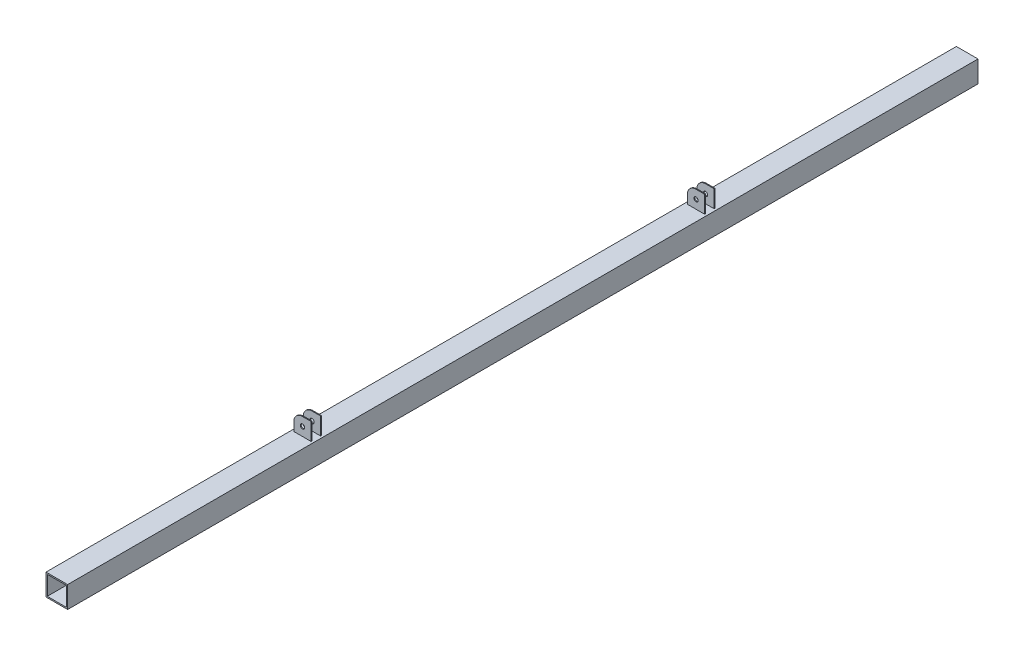
ISO-10303-21;
HEADER;
FILE_DESCRIPTION(('STEP AP214'),'2;1');
FILE_NAME('part.step','',(''),(''),'','','');
FILE_SCHEMA(('AUTOMOTIVE_DESIGN { 1 0 10303 214 1 1 1 1 }'));
ENDSEC;
DATA;
#1=APPLICATION_CONTEXT('core data for automotive mechanical design processes');
#2=APPLICATION_PROTOCOL_DEFINITION('international standard','automotive_design',2000,#1);
#3=PRODUCT_CONTEXT('',#1,'mechanical');
#4=PRODUCT('Part','Part','',(#3));
#5=PRODUCT_RELATED_PRODUCT_CATEGORY('part','',(#4));
#6=PRODUCT_DEFINITION_FORMATION('','',#4);
#7=PRODUCT_DEFINITION_CONTEXT('part definition',#1,'design');
#8=PRODUCT_DEFINITION('design','',#6,#7);
#9=PRODUCT_DEFINITION_SHAPE('','',#8);
#10=(LENGTH_UNIT() NAMED_UNIT(*) SI_UNIT(.MILLI.,.METRE.));
#11=(NAMED_UNIT(*) PLANE_ANGLE_UNIT() SI_UNIT($,.RADIAN.));
#12=(NAMED_UNIT(*) SI_UNIT($,.STERADIAN.) SOLID_ANGLE_UNIT());
#13=UNCERTAINTY_MEASURE_WITH_UNIT(LENGTH_MEASURE(1.E-05),#10,'distance_accuracy_value','');
#14=(GEOMETRIC_REPRESENTATION_CONTEXT(3) GLOBAL_UNCERTAINTY_ASSIGNED_CONTEXT((#13)) GLOBAL_UNIT_ASSIGNED_CONTEXT((#10,
#11,#12)) REPRESENTATION_CONTEXT('',''));
#15=CARTESIAN_POINT('',(0.,0.,0.));
#16=DIRECTION('',(0.,0.,1.));
#17=DIRECTION('',(1.,0.,0.));
#18=AXIS2_PLACEMENT_3D('',#15,#16,#17);
#19=CARTESIAN_POINT('',(-25.,25.,1052.5));
#20=DIRECTION('',(0.,-1.,0.));
#21=DIRECTION('',(0.,0.,-1.));
#22=AXIS2_PLACEMENT_3D('',#19,#20,#21);
#23=PLANE('',#22);
#24=DIRECTION('',(0.,0.,1.));
#25=VECTOR('',#24,1.);
#26=CARTESIAN_POINT('',(-20.,25.,460.5));
#27=LINE('',#26,#25);
#28=CARTESIAN_POINT('',(-20.,25.,460.5));
#29=VERTEX_POINT('',#28);
#30=CARTESIAN_POINT('',(-20.,25.,462.5));
#31=VERTEX_POINT('',#30);
#32=EDGE_CURVE('E264',#29,#31,#27,.T.);
#33=ORIENTED_EDGE('',*,*,#32,.F.);
#34=DIRECTION('',(-1.,0.,0.));
#35=VECTOR('',#34,1.);
#36=CARTESIAN_POINT('',(-20.,25.,460.5));
#37=LINE('',#36,#35);
#38=CARTESIAN_POINT('',(20.,25.,460.5));
#39=VERTEX_POINT('',#38);
#40=EDGE_CURVE('E268',#39,#29,#37,.T.);
#41=ORIENTED_EDGE('',*,*,#40,.F.);
#42=DIRECTION('',(0.,0.,-1.));
#43=VECTOR('',#42,1.);
#44=CARTESIAN_POINT('',(20.,25.,460.5));
#45=LINE('',#44,#43);
#46=CARTESIAN_POINT('',(20.,25.,462.5));
#47=VERTEX_POINT('',#46);
#48=EDGE_CURVE('E279',#47,#39,#45,.T.);
#49=ORIENTED_EDGE('',*,*,#48,.F.);
#50=DIRECTION('',(1.,0.,0.));
#51=VECTOR('',#50,1.);
#52=CARTESIAN_POINT('',(-20.,25.,462.5));
#53=LINE('',#52,#51);
#54=EDGE_CURVE('E276',#31,#47,#53,.T.);
#55=ORIENTED_EDGE('',*,*,#54,.F.);
#56=EDGE_LOOP('',(#33,#41,#49,#55));
#57=FACE_BOUND('',#56,.T.);
#58=DIRECTION('',(0.,0.,1.));
#59=VECTOR('',#58,1.);
#60=CARTESIAN_POINT('',(-20.0000000000001,25.,-449.5));
#61=LINE('',#60,#59);
#62=CARTESIAN_POINT('',(-20.0000000000001,25.,-449.5));
#63=VERTEX_POINT('',#62);
#64=CARTESIAN_POINT('',(-20.0000000000001,25.,-447.5));
#65=VERTEX_POINT('',#64);
#66=EDGE_CURVE('E322',#63,#65,#61,.T.);
#67=ORIENTED_EDGE('',*,*,#66,.F.);
#68=DIRECTION('',(-1.,0.,0.));
#69=VECTOR('',#68,1.);
#70=CARTESIAN_POINT('',(-20.0000000000001,25.,-449.5));
#71=LINE('',#70,#69);
#72=CARTESIAN_POINT('',(19.9999999999999,25.,-449.5));
#73=VERTEX_POINT('',#72);
#74=EDGE_CURVE('E326',#73,#63,#71,.T.);
#75=ORIENTED_EDGE('',*,*,#74,.F.);
#76=DIRECTION('',(0.,0.,-1.));
#77=VECTOR('',#76,1.);
#78=CARTESIAN_POINT('',(19.9999999999999,25.,-449.5));
#79=LINE('',#78,#77);
#80=CARTESIAN_POINT('',(19.9999999999999,25.,-447.5));
#81=VERTEX_POINT('',#80);
#82=EDGE_CURVE('E337',#81,#73,#79,.T.);
#83=ORIENTED_EDGE('',*,*,#82,.F.);
#84=DIRECTION('',(1.,0.,0.));
#85=VECTOR('',#84,1.);
#86=CARTESIAN_POINT('',(-20.0000000000001,25.,-447.5));
#87=LINE('',#86,#85);
#88=EDGE_CURVE('E334',#65,#81,#87,.T.);
#89=ORIENTED_EDGE('',*,*,#88,.F.);
#90=EDGE_LOOP('',(#67,#75,#83,#89));
#91=FACE_BOUND('',#90,.T.);
#92=DIRECTION('',(-1.,0.,0.));
#93=VECTOR('',#92,1.);
#94=CARTESIAN_POINT('',(-25.,25.,-1052.5));
#95=LINE('',#94,#93);
#96=CARTESIAN_POINT('',(25.,25.,-1052.5));
#97=VERTEX_POINT('',#96);
#98=CARTESIAN_POINT('',(-25.,25.,-1052.5));
#99=VERTEX_POINT('',#98);
#100=EDGE_CURVE('E396',#97,#99,#95,.T.);
#101=ORIENTED_EDGE('',*,*,#100,.T.);
#102=DIRECTION('',(0.,0.,-1.));
#103=VECTOR('',#102,1.);
#104=CARTESIAN_POINT('',(-25.,25.,1052.5));
#105=LINE('',#104,#103);
#106=CARTESIAN_POINT('',(-25.,25.,1052.5));
#107=VERTEX_POINT('',#106);
#108=EDGE_CURVE('E406',#107,#99,#105,.T.);
#109=ORIENTED_EDGE('',*,*,#108,.F.);
#110=DIRECTION('',(-1.,0.,0.));
#111=VECTOR('',#110,1.);
#112=CARTESIAN_POINT('',(-25.,25.,1052.5));
#113=LINE('',#112,#111);
#114=CARTESIAN_POINT('',(25.,25.,1052.5));
#115=VERTEX_POINT('',#114);
#116=EDGE_CURVE('E386',#115,#107,#113,.T.);
#117=ORIENTED_EDGE('',*,*,#116,.F.);
#118=DIRECTION('',(0.,0.,-1.));
#119=VECTOR('',#118,1.);
#120=CARTESIAN_POINT('',(25.,25.,1052.5));
#121=LINE('',#120,#119);
#122=EDGE_CURVE('E409',#115,#97,#121,.T.);
#123=ORIENTED_EDGE('',*,*,#122,.T.);
#124=EDGE_LOOP('',(#101,#109,#117,#123));
#125=FACE_BOUND('',#124,.T.);
#126=DIRECTION('',(0.,0.,1.));
#127=VECTOR('',#126,1.);
#128=CARTESIAN_POINT('',(-20.0000000000001,25.,-427.5));
#129=LINE('',#128,#127);
#130=CARTESIAN_POINT('',(-20.0000000000001,25.,-427.5));
#131=VERTEX_POINT('',#130);
#132=CARTESIAN_POINT('',(-20.0000000000001,25.,-425.5));
#133=VERTEX_POINT('',#132);
#134=EDGE_CURVE('E293',#131,#133,#129,.T.);
#135=ORIENTED_EDGE('',*,*,#134,.F.);
#136=DIRECTION('',(-1.,0.,0.));
#137=VECTOR('',#136,1.);
#138=CARTESIAN_POINT('',(-20.0000000000001,25.,-427.5));
#139=LINE('',#138,#137);
#140=CARTESIAN_POINT('',(19.9999999999999,25.,-427.5));
#141=VERTEX_POINT('',#140);
#142=EDGE_CURVE('E297',#141,#131,#139,.T.);
#143=ORIENTED_EDGE('',*,*,#142,.F.);
#144=DIRECTION('',(0.,0.,-1.));
#145=VECTOR('',#144,1.);
#146=CARTESIAN_POINT('',(19.9999999999999,25.,-427.5));
#147=LINE('',#146,#145);
#148=CARTESIAN_POINT('',(19.9999999999999,25.,-425.5));
#149=VERTEX_POINT('',#148);
#150=EDGE_CURVE('E308',#149,#141,#147,.T.);
#151=ORIENTED_EDGE('',*,*,#150,.F.);
#152=DIRECTION('',(1.,0.,0.));
#153=VECTOR('',#152,1.);
#154=CARTESIAN_POINT('',(-20.0000000000001,25.,-425.5));
#155=LINE('',#154,#153);
#156=EDGE_CURVE('E305',#133,#149,#155,.T.);
#157=ORIENTED_EDGE('',*,*,#156,.F.);
#158=EDGE_LOOP('',(#135,#143,#151,#157));
#159=FACE_BOUND('',#158,.T.);
#160=DIRECTION('',(0.,0.,1.));
#161=VECTOR('',#160,1.);
#162=CARTESIAN_POINT('',(-20.,25.,482.5));
#163=LINE('',#162,#161);
#164=CARTESIAN_POINT('',(-20.,25.,482.5));
#165=VERTEX_POINT('',#164);
#166=CARTESIAN_POINT('',(-20.,25.,484.5));
#167=VERTEX_POINT('',#166);
#168=EDGE_CURVE('E252',#165,#167,#163,.T.);
#169=ORIENTED_EDGE('',*,*,#168,.F.);
#170=DIRECTION('',(-1.,0.,0.));
#171=VECTOR('',#170,1.);
#172=CARTESIAN_POINT('',(-20.,25.,482.5));
#173=LINE('',#172,#171);
#174=CARTESIAN_POINT('',(20.,25.,482.5));
#175=VERTEX_POINT('',#174);
#176=EDGE_CURVE('E230',#175,#165,#173,.T.);
#177=ORIENTED_EDGE('',*,*,#176,.F.);
#178=DIRECTION('',(0.,0.,-1.));
#179=VECTOR('',#178,1.);
#180=CARTESIAN_POINT('',(20.,25.,482.5));
#181=LINE('',#180,#179);
#182=CARTESIAN_POINT('',(20.,25.,484.5));
#183=VERTEX_POINT('',#182);
#184=EDGE_CURVE('E257',#183,#175,#181,.T.);
#185=ORIENTED_EDGE('',*,*,#184,.F.);
#186=DIRECTION('',(1.,0.,0.));
#187=VECTOR('',#186,1.);
#188=CARTESIAN_POINT('',(-20.,25.,484.5));
#189=LINE('',#188,#187);
#190=EDGE_CURVE('E237',#167,#183,#189,.T.);
#191=ORIENTED_EDGE('',*,*,#190,.F.);
#192=EDGE_LOOP('',(#169,#177,#185,#191));
#193=FACE_BOUND('',#192,.T.);
#194=ADVANCED_FACE('F37',(#57,#91,#125,#159,#193),#23,.F.);
#195=CARTESIAN_POINT('',(0.,0.,1052.5));
#196=DIRECTION('',(0.,0.,-1.));
#197=DIRECTION('',(-1.,0.,0.));
#198=AXIS2_PLACEMENT_3D('',#195,#196,#197);
#199=PLANE('',#198);
#200=DIRECTION('',(0.,1.,0.));
#201=VECTOR('',#200,1.);
#202=CARTESIAN_POINT('',(25.,-25.,1052.5));
#203=LINE('',#202,#201);
#204=CARTESIAN_POINT('',(25.,-25.,1052.5));
#205=VERTEX_POINT('',#204);
#206=EDGE_CURVE('E383',#205,#115,#203,.T.);
#207=ORIENTED_EDGE('',*,*,#206,.T.);
#208=ORIENTED_EDGE('',*,*,#116,.T.);
#209=DIRECTION('',(0.,-1.,0.));
#210=VECTOR('',#209,1.);
#211=CARTESIAN_POINT('',(-25.,-25.,1052.5));
#212=LINE('',#211,#210);
#213=CARTESIAN_POINT('',(-25.,-25.,1052.5));
#214=VERTEX_POINT('',#213);
#215=EDGE_CURVE('E389',#107,#214,#212,.T.);
#216=ORIENTED_EDGE('',*,*,#215,.T.);
#217=DIRECTION('',(1.,0.,0.));
#218=VECTOR('',#217,1.);
#219=CARTESIAN_POINT('',(-25.,-25.,1052.5));
#220=LINE('',#219,#218);
#221=EDGE_CURVE('E391',#214,#205,#220,.T.);
#222=ORIENTED_EDGE('',*,*,#221,.T.);
#223=EDGE_LOOP('',(#207,#208,#216,#222));
#224=FACE_BOUND('',#223,.T.);
#225=DIRECTION('',(0.,1.,0.));
#226=VECTOR('',#225,1.);
#227=CARTESIAN_POINT('',(22.,-22.,1052.5));
#228=LINE('',#227,#226);
#229=CARTESIAN_POINT('',(22.,-22.,1052.5));
#230=VERTEX_POINT('',#229);
#231=CARTESIAN_POINT('',(22.,22.,1052.5));
#232=VERTEX_POINT('',#231);
#233=EDGE_CURVE('E352',#230,#232,#228,.T.);
#234=ORIENTED_EDGE('',*,*,#233,.F.);
#235=DIRECTION('',(1.,0.,0.));
#236=VECTOR('',#235,1.);
#237=CARTESIAN_POINT('',(-22.,-22.,1052.5));
#238=LINE('',#237,#236);
#239=CARTESIAN_POINT('',(-22.,-22.,1052.5));
#240=VERTEX_POINT('',#239);
#241=EDGE_CURVE('E360',#240,#230,#238,.T.);
#242=ORIENTED_EDGE('',*,*,#241,.F.);
#243=DIRECTION('',(0.,-1.,0.));
#244=VECTOR('',#243,1.);
#245=CARTESIAN_POINT('',(-22.,-22.,1052.5));
#246=LINE('',#245,#244);
#247=CARTESIAN_POINT('',(-22.,22.,1052.5));
#248=VERTEX_POINT('',#247);
#249=EDGE_CURVE('E357',#248,#240,#246,.T.);
#250=ORIENTED_EDGE('',*,*,#249,.F.);
#251=DIRECTION('',(-1.,0.,0.));
#252=VECTOR('',#251,1.);
#253=CARTESIAN_POINT('',(-22.,22.,1052.5));
#254=LINE('',#253,#252);
#255=EDGE_CURVE('E354',#232,#248,#254,.T.);
#256=ORIENTED_EDGE('',*,*,#255,.F.);
#257=EDGE_LOOP('',(#234,#242,#250,#256));
#258=FACE_BOUND('',#257,.T.);
#259=ADVANCED_FACE('F468',(#224,#258),#199,.F.);
#260=CARTESIAN_POINT('',(0.,0.,-1052.5));
#261=DIRECTION('',(0.,0.,-1.));
#262=DIRECTION('',(-1.,0.,0.));
#263=AXIS2_PLACEMENT_3D('',#260,#261,#262);
#264=PLANE('',#263);
#265=DIRECTION('',(0.,1.,0.));
#266=VECTOR('',#265,1.);
#267=CARTESIAN_POINT('',(25.,-25.,-1052.5));
#268=LINE('',#267,#266);
#269=CARTESIAN_POINT('',(25.,-25.,-1052.5));
#270=VERTEX_POINT('',#269);
#271=EDGE_CURVE('E382',#270,#97,#268,.T.);
#272=ORIENTED_EDGE('',*,*,#271,.F.);
#273=DIRECTION('',(1.,0.,0.));
#274=VECTOR('',#273,1.);
#275=CARTESIAN_POINT('',(-25.,-25.,-1052.5));
#276=LINE('',#275,#274);
#277=CARTESIAN_POINT('',(-25.,-25.,-1052.5));
#278=VERTEX_POINT('',#277);
#279=EDGE_CURVE('E387',#278,#270,#276,.T.);
#280=ORIENTED_EDGE('',*,*,#279,.F.);
#281=DIRECTION('',(0.,-1.,0.));
#282=VECTOR('',#281,1.);
#283=CARTESIAN_POINT('',(-25.,-25.,-1052.5));
#284=LINE('',#283,#282);
#285=EDGE_CURVE('E398',#99,#278,#284,.T.);
#286=ORIENTED_EDGE('',*,*,#285,.F.);
#287=ORIENTED_EDGE('',*,*,#100,.F.);
#288=EDGE_LOOP('',(#272,#280,#286,#287));
#289=FACE_BOUND('',#288,.T.);
#290=DIRECTION('',(1.,0.,0.));
#291=VECTOR('',#290,1.);
#292=CARTESIAN_POINT('',(-22.,-22.,-1052.5));
#293=LINE('',#292,#291);
#294=CARTESIAN_POINT('',(-22.,-22.,-1052.5));
#295=VERTEX_POINT('',#294);
#296=CARTESIAN_POINT('',(22.,-22.,-1052.5));
#297=VERTEX_POINT('',#296);
#298=EDGE_CURVE('E355',#295,#297,#293,.T.);
#299=ORIENTED_EDGE('',*,*,#298,.T.);
#300=DIRECTION('',(0.,1.,0.));
#301=VECTOR('',#300,1.);
#302=CARTESIAN_POINT('',(22.,-22.,-1052.5));
#303=LINE('',#302,#301);
#304=CARTESIAN_POINT('',(22.,22.,-1052.5));
#305=VERTEX_POINT('',#304);
#306=EDGE_CURVE('E351',#297,#305,#303,.T.);
#307=ORIENTED_EDGE('',*,*,#306,.T.);
#308=DIRECTION('',(-1.,0.,0.));
#309=VECTOR('',#308,1.);
#310=CARTESIAN_POINT('',(-22.,22.,-1052.5));
#311=LINE('',#310,#309);
#312=CARTESIAN_POINT('',(-22.,22.,-1052.5));
#313=VERTEX_POINT('',#312);
#314=EDGE_CURVE('E365',#305,#313,#311,.T.);
#315=ORIENTED_EDGE('',*,*,#314,.T.);
#316=DIRECTION('',(0.,-1.,0.));
#317=VECTOR('',#316,1.);
#318=CARTESIAN_POINT('',(-22.,-22.,-1052.5));
#319=LINE('',#318,#317);
#320=EDGE_CURVE('E368',#313,#295,#319,.T.);
#321=ORIENTED_EDGE('',*,*,#320,.T.);
#322=EDGE_LOOP('',(#299,#307,#315,#321));
#323=FACE_BOUND('',#322,.T.);
#324=ADVANCED_FACE('F474',(#289,#323),#264,.T.);
#325=CARTESIAN_POINT('',(25.,-25.,1052.5));
#326=DIRECTION('',(-1.,0.,0.));
#327=DIRECTION('',(0.,0.,1.));
#328=AXIS2_PLACEMENT_3D('',#325,#326,#327);
#329=PLANE('',#328);
#330=ORIENTED_EDGE('',*,*,#271,.T.);
#331=ORIENTED_EDGE('',*,*,#122,.F.);
#332=ORIENTED_EDGE('',*,*,#206,.F.);
#333=DIRECTION('',(0.,0.,-1.));
#334=VECTOR('',#333,1.);
#335=CARTESIAN_POINT('',(25.,-25.,1052.5));
#336=LINE('',#335,#334);
#337=EDGE_CURVE('E393',#205,#270,#336,.T.);
#338=ORIENTED_EDGE('',*,*,#337,.T.);
#339=EDGE_LOOP('',(#330,#331,#332,#338));
#340=FACE_BOUND('',#339,.T.);
#341=ADVANCED_FACE('F483',(#340),#329,.F.);
#342=CARTESIAN_POINT('',(-25.,-25.,1052.5));
#343=DIRECTION('',(1.,0.,0.));
#344=DIRECTION('',(0.,0.,-1.));
#345=AXIS2_PLACEMENT_3D('',#342,#343,#344);
#346=PLANE('',#345);
#347=ORIENTED_EDGE('',*,*,#285,.T.);
#348=DIRECTION('',(0.,0.,-1.));
#349=VECTOR('',#348,1.);
#350=CARTESIAN_POINT('',(-25.,-25.,1052.5));
#351=LINE('',#350,#349);
#352=EDGE_CURVE('E403',#214,#278,#351,.T.);
#353=ORIENTED_EDGE('',*,*,#352,.F.);
#354=ORIENTED_EDGE('',*,*,#215,.F.);
#355=ORIENTED_EDGE('',*,*,#108,.T.);
#356=EDGE_LOOP('',(#347,#353,#354,#355));
#357=FACE_BOUND('',#356,.T.);
#358=ADVANCED_FACE('F481',(#357),#346,.F.);
#359=CARTESIAN_POINT('',(-25.,-25.,1052.5));
#360=DIRECTION('',(0.,1.,0.));
#361=DIRECTION('',(0.,0.,1.));
#362=AXIS2_PLACEMENT_3D('',#359,#360,#361);
#363=PLANE('',#362);
#364=ORIENTED_EDGE('',*,*,#279,.T.);
#365=ORIENTED_EDGE('',*,*,#337,.F.);
#366=ORIENTED_EDGE('',*,*,#221,.F.);
#367=ORIENTED_EDGE('',*,*,#352,.T.);
#368=EDGE_LOOP('',(#364,#365,#366,#367));
#369=FACE_BOUND('',#368,.T.);
#370=ADVANCED_FACE('F576',(#369),#363,.F.);
#371=CARTESIAN_POINT('',(22.,-22.,1052.5));
#372=DIRECTION('',(-1.,0.,0.));
#373=DIRECTION('',(0.,0.,1.));
#374=AXIS2_PLACEMENT_3D('',#371,#372,#373);
#375=PLANE('',#374);
#376=ORIENTED_EDGE('',*,*,#306,.F.);
#377=DIRECTION('',(0.,0.,-1.));
#378=VECTOR('',#377,1.);
#379=CARTESIAN_POINT('',(22.,-22.,1052.5));
#380=LINE('',#379,#378);
#381=EDGE_CURVE('E362',#230,#297,#380,.T.);
#382=ORIENTED_EDGE('',*,*,#381,.F.);
#383=ORIENTED_EDGE('',*,*,#233,.T.);
#384=DIRECTION('',(0.,0.,-1.));
#385=VECTOR('',#384,1.);
#386=CARTESIAN_POINT('',(22.,22.,1052.5));
#387=LINE('',#386,#385);
#388=EDGE_CURVE('E379',#232,#305,#387,.T.);
#389=ORIENTED_EDGE('',*,*,#388,.T.);
#390=EDGE_LOOP('',(#376,#382,#383,#389));
#391=FACE_BOUND('',#390,.T.);
#392=ADVANCED_FACE('F573',(#391),#375,.T.);
#393=CARTESIAN_POINT('',(-22.,22.,1052.5));
#394=DIRECTION('',(0.,-1.,0.));
#395=DIRECTION('',(0.,0.,-1.));
#396=AXIS2_PLACEMENT_3D('',#393,#394,#395);
#397=PLANE('',#396);
#398=ORIENTED_EDGE('',*,*,#314,.F.);
#399=ORIENTED_EDGE('',*,*,#388,.F.);
#400=ORIENTED_EDGE('',*,*,#255,.T.);
#401=DIRECTION('',(0.,0.,-1.));
#402=VECTOR('',#401,1.);
#403=CARTESIAN_POINT('',(-22.,22.,1052.5));
#404=LINE('',#403,#402);
#405=EDGE_CURVE('E377',#248,#313,#404,.T.);
#406=ORIENTED_EDGE('',*,*,#405,.T.);
#407=EDGE_LOOP('',(#398,#399,#400,#406));
#408=FACE_BOUND('',#407,.T.);
#409=ADVANCED_FACE('F569',(#408),#397,.T.);
#410=CARTESIAN_POINT('',(-22.,-22.,1052.5));
#411=DIRECTION('',(1.,0.,0.));
#412=DIRECTION('',(0.,0.,-1.));
#413=AXIS2_PLACEMENT_3D('',#410,#411,#412);
#414=PLANE('',#413);
#415=ORIENTED_EDGE('',*,*,#320,.F.);
#416=ORIENTED_EDGE('',*,*,#405,.F.);
#417=ORIENTED_EDGE('',*,*,#249,.T.);
#418=DIRECTION('',(0.,0.,-1.));
#419=VECTOR('',#418,1.);
#420=CARTESIAN_POINT('',(-22.,-22.,1052.5));
#421=LINE('',#420,#419);
#422=EDGE_CURVE('E375',#240,#295,#421,.T.);
#423=ORIENTED_EDGE('',*,*,#422,.T.);
#424=EDGE_LOOP('',(#415,#416,#417,#423));
#425=FACE_BOUND('',#424,.T.);
#426=ADVANCED_FACE('F565',(#425),#414,.T.);
#427=CARTESIAN_POINT('',(-22.,-22.,1052.5));
#428=DIRECTION('',(0.,1.,0.));
#429=DIRECTION('',(0.,0.,1.));
#430=AXIS2_PLACEMENT_3D('',#427,#428,#429);
#431=PLANE('',#430);
#432=ORIENTED_EDGE('',*,*,#298,.F.);
#433=ORIENTED_EDGE('',*,*,#422,.F.);
#434=ORIENTED_EDGE('',*,*,#241,.T.);
#435=ORIENTED_EDGE('',*,*,#381,.T.);
#436=EDGE_LOOP('',(#432,#433,#434,#435));
#437=FACE_BOUND('',#436,.T.);
#438=ADVANCED_FACE('F562',(#437),#431,.T.);
#439=CARTESIAN_POINT('',(-20.0000000000001,65.,-449.5));
#440=DIRECTION('',(1.,0.,0.));
#441=DIRECTION('',(0.,0.,-1.));
#442=AXIS2_PLACEMENT_3D('',#439,#440,#441);
#443=PLANE('',#442);
#444=DIRECTION('',(0.,-1.,0.));
#445=VECTOR('',#444,1.);
#446=CARTESIAN_POINT('',(-20.0000000000001,65.,-447.5));
#447=LINE('',#446,#445);
#448=CARTESIAN_POINT('',(-20.0000000000001,45.,-447.5));
#449=VERTEX_POINT('',#448);
#450=EDGE_CURVE('E349',#449,#65,#447,.T.);
#451=ORIENTED_EDGE('',*,*,#450,.F.);
#452=DIRECTION('',(0.,0.,1.));
#453=VECTOR('',#452,1.);
#454=CARTESIAN_POINT('',(-20.0000000000001,45.,-449.5));
#455=LINE('',#454,#453);
#456=CARTESIAN_POINT('',(-20.0000000000001,45.,-449.5));
#457=VERTEX_POINT('',#456);
#458=EDGE_CURVE('E45',#449,#457,#455,.F.);
#459=ORIENTED_EDGE('',*,*,#458,.T.);
#460=DIRECTION('',(0.,-1.,0.));
#461=VECTOR('',#460,1.);
#462=CARTESIAN_POINT('',(-20.0000000000001,65.,-449.5));
#463=LINE('',#462,#461);
#464=EDGE_CURVE('E331',#457,#63,#463,.T.);
#465=ORIENTED_EDGE('',*,*,#464,.T.);
#466=ORIENTED_EDGE('',*,*,#66,.T.);
#467=EDGE_LOOP('',(#451,#459,#465,#466));
#468=FACE_BOUND('',#467,.T.);
#469=ADVANCED_FACE('F558',(#468),#443,.F.);
#470=CARTESIAN_POINT('',(-20.0000000000001,65.,-447.5));
#471=DIRECTION('',(0.,0.,-1.));
#472=DIRECTION('',(-1.,0.,0.));
#473=AXIS2_PLACEMENT_3D('',#470,#471,#472);
#474=PLANE('',#473);
#475=CARTESIAN_POINT('',(0.,45.,-447.5));
#476=DIRECTION('',(0.,0.,-1.));
#477=DIRECTION('',(-1.,0.,0.));
#478=AXIS2_PLACEMENT_3D('',#475,#476,#477);
#479=CIRCLE('',#478,5.);
#480=CARTESIAN_POINT('',(-5.00000000000001,45.,-447.5));
#481=VERTEX_POINT('',#480);
#482=EDGE_CURVE('E255',#481,#481,#479,.T.);
#483=ORIENTED_EDGE('',*,*,#482,.T.);
#484=EDGE_LOOP('',(#483));
#485=FACE_BOUND('',#484,.T.);
#486=DIRECTION('',(1.,0.,0.));
#487=VECTOR('',#486,1.);
#488=CARTESIAN_POINT('',(-20.0000000000001,65.,-447.5));
#489=LINE('',#488,#487);
#490=CARTESIAN_POINT('',(-1.17961196366423E-13,65.,-447.5));
#491=VERTEX_POINT('',#490);
#492=CARTESIAN_POINT('',(19.9999999999999,65.,-447.5));
#493=VERTEX_POINT('',#492);
#494=EDGE_CURVE('E323',#491,#493,#489,.T.);
#495=ORIENTED_EDGE('',*,*,#494,.F.);
#496=CARTESIAN_POINT('',(-1.17961196366423E-13,45.,-447.5));
#497=DIRECTION('',(0.,0.,-1.));
#498=DIRECTION('',(-1.,0.,0.));
#499=AXIS2_PLACEMENT_3D('',#496,#497,#498);
#500=CIRCLE('',#499,20.);
#501=EDGE_CURVE('E59',#491,#449,#500,.F.);
#502=ORIENTED_EDGE('',*,*,#501,.T.);
#503=ORIENTED_EDGE('',*,*,#450,.T.);
#504=ORIENTED_EDGE('',*,*,#88,.T.);
#505=DIRECTION('',(0.,-1.,0.));
#506=VECTOR('',#505,1.);
#507=CARTESIAN_POINT('',(19.9999999999999,65.,-447.5));
#508=LINE('',#507,#506);
#509=EDGE_CURVE('E346',#493,#81,#508,.T.);
#510=ORIENTED_EDGE('',*,*,#509,.F.);
#511=EDGE_LOOP('',(#495,#502,#503,#504,#510));
#512=FACE_BOUND('',#511,.T.);
#513=ADVANCED_FACE('F452',(#485,#512),#474,.F.);
#514=CARTESIAN_POINT('',(19.9999999999999,65.,-449.5));
#515=DIRECTION('',(-1.,0.,0.));
#516=DIRECTION('',(0.,0.,1.));
#517=AXIS2_PLACEMENT_3D('',#514,#515,#516);
#518=PLANE('',#517);
#519=ORIENTED_EDGE('',*,*,#82,.T.);
#520=DIRECTION('',(0.,-1.,0.));
#521=VECTOR('',#520,1.);
#522=CARTESIAN_POINT('',(19.9999999999999,65.,-449.5));
#523=LINE('',#522,#521);
#524=CARTESIAN_POINT('',(19.9999999999999,65.,-449.5));
#525=VERTEX_POINT('',#524);
#526=EDGE_CURVE('E343',#525,#73,#523,.T.);
#527=ORIENTED_EDGE('',*,*,#526,.F.);
#528=DIRECTION('',(0.,0.,-1.));
#529=VECTOR('',#528,1.);
#530=CARTESIAN_POINT('',(19.9999999999999,65.,-449.5));
#531=LINE('',#530,#529);
#532=EDGE_CURVE('E325',#493,#525,#531,.T.);
#533=ORIENTED_EDGE('',*,*,#532,.F.);
#534=ORIENTED_EDGE('',*,*,#509,.T.);
#535=EDGE_LOOP('',(#519,#527,#533,#534));
#536=FACE_BOUND('',#535,.T.);
#537=ADVANCED_FACE('F457',(#536),#518,.F.);
#538=CARTESIAN_POINT('',(-20.0000000000001,65.,-449.5));
#539=DIRECTION('',(0.,0.,1.));
#540=DIRECTION('',(1.,0.,0.));
#541=AXIS2_PLACEMENT_3D('',#538,#539,#540);
#542=PLANE('',#541);
#543=CARTESIAN_POINT('',(0.,45.,-449.5));
#544=DIRECTION('',(0.,0.,1.));
#545=DIRECTION('',(1.,0.,0.));
#546=AXIS2_PLACEMENT_3D('',#543,#544,#545);
#547=CIRCLE('',#546,5.);
#548=CARTESIAN_POINT('',(4.99999999999999,45.,-449.5));
#549=VERTEX_POINT('',#548);
#550=EDGE_CURVE('E650',#549,#549,#547,.T.);
#551=ORIENTED_EDGE('',*,*,#550,.T.);
#552=EDGE_LOOP('',(#551));
#553=FACE_BOUND('',#552,.T.);
#554=ORIENTED_EDGE('',*,*,#464,.F.);
#555=CARTESIAN_POINT('',(-1.17961196366423E-13,45.,-449.5));
#556=DIRECTION('',(0.,0.,1.));
#557=DIRECTION('',(1.,0.,0.));
#558=AXIS2_PLACEMENT_3D('',#555,#556,#557);
#559=CIRCLE('',#558,20.);
#560=CARTESIAN_POINT('',(-1.17961196366423E-13,65.,-449.5));
#561=VERTEX_POINT('',#560);
#562=EDGE_CURVE('E11',#457,#561,#559,.F.);
#563=ORIENTED_EDGE('',*,*,#562,.T.);
#564=DIRECTION('',(-1.,0.,0.));
#565=VECTOR('',#564,1.);
#566=CARTESIAN_POINT('',(-20.0000000000001,65.,-449.5));
#567=LINE('',#566,#565);
#568=EDGE_CURVE('E328',#525,#561,#567,.T.);
#569=ORIENTED_EDGE('',*,*,#568,.F.);
#570=ORIENTED_EDGE('',*,*,#526,.T.);
#571=ORIENTED_EDGE('',*,*,#74,.T.);
#572=EDGE_LOOP('',(#554,#563,#569,#570,#571));
#573=FACE_BOUND('',#572,.T.);
#574=ADVANCED_FACE('F459',(#553,#573),#542,.F.);
#575=CARTESIAN_POINT('',(0.,65.,0.));
#576=DIRECTION('',(0.,1.,0.));
#577=DIRECTION('',(0.,0.,1.));
#578=AXIS2_PLACEMENT_3D('',#575,#576,#577);
#579=PLANE('',#578);
#580=ORIENTED_EDGE('',*,*,#568,.T.);
#581=DIRECTION('',(0.,0.,1.));
#582=VECTOR('',#581,1.);
#583=CARTESIAN_POINT('',(-1.17961196366423E-13,65.,-447.5));
#584=LINE('',#583,#582);
#585=EDGE_CURVE('E442',#561,#491,#584,.T.);
#586=ORIENTED_EDGE('',*,*,#585,.T.);
#587=ORIENTED_EDGE('',*,*,#494,.T.);
#588=ORIENTED_EDGE('',*,*,#532,.T.);
#589=EDGE_LOOP('',(#580,#586,#587,#588));
#590=FACE_BOUND('',#589,.T.);
#591=ADVANCED_FACE('F447',(#590),#579,.T.);
#592=CARTESIAN_POINT('',(-20.0000000000001,65.,-427.5));
#593=DIRECTION('',(1.,0.,0.));
#594=DIRECTION('',(0.,0.,-1.));
#595=AXIS2_PLACEMENT_3D('',#592,#593,#594);
#596=PLANE('',#595);
#597=DIRECTION('',(0.,-1.,0.));
#598=VECTOR('',#597,1.);
#599=CARTESIAN_POINT('',(-20.0000000000001,65.,-425.5));
#600=LINE('',#599,#598);
#601=CARTESIAN_POINT('',(-20.0000000000001,45.,-425.5));
#602=VERTEX_POINT('',#601);
#603=EDGE_CURVE('E320',#602,#133,#600,.T.);
#604=ORIENTED_EDGE('',*,*,#603,.F.);
#605=DIRECTION('',(0.,0.,1.));
#606=VECTOR('',#605,1.);
#607=CARTESIAN_POINT('',(-20.0000000000001,45.,-427.5));
#608=LINE('',#607,#606);
#609=CARTESIAN_POINT('',(-20.0000000000001,45.,-427.5));
#610=VERTEX_POINT('',#609);
#611=EDGE_CURVE('E438',#602,#610,#608,.F.);
#612=ORIENTED_EDGE('',*,*,#611,.T.);
#613=DIRECTION('',(0.,-1.,0.));
#614=VECTOR('',#613,1.);
#615=CARTESIAN_POINT('',(-20.0000000000001,65.,-427.5));
#616=LINE('',#615,#614);
#617=EDGE_CURVE('E302',#610,#131,#616,.T.);
#618=ORIENTED_EDGE('',*,*,#617,.T.);
#619=ORIENTED_EDGE('',*,*,#134,.T.);
#620=EDGE_LOOP('',(#604,#612,#618,#619));
#621=FACE_BOUND('',#620,.T.);
#622=ADVANCED_FACE('F544',(#621),#596,.F.);
#623=CARTESIAN_POINT('',(-20.0000000000001,65.,-425.5));
#624=DIRECTION('',(0.,0.,-1.));
#625=DIRECTION('',(-1.,0.,0.));
#626=AXIS2_PLACEMENT_3D('',#623,#624,#625);
#627=PLANE('',#626);
#628=CARTESIAN_POINT('',(0.,45.,-425.5));
#629=DIRECTION('',(0.,0.,-1.));
#630=DIRECTION('',(-1.,0.,0.));
#631=AXIS2_PLACEMENT_3D('',#628,#629,#630);
#632=CIRCLE('',#631,5.);
#633=CARTESIAN_POINT('',(-5.00000000000001,45.,-425.5));
#634=VERTEX_POINT('',#633);
#635=EDGE_CURVE('E647',#634,#634,#632,.T.);
#636=ORIENTED_EDGE('',*,*,#635,.T.);
#637=EDGE_LOOP('',(#636));
#638=FACE_BOUND('',#637,.T.);
#639=DIRECTION('',(1.,0.,0.));
#640=VECTOR('',#639,1.);
#641=CARTESIAN_POINT('',(-20.0000000000001,65.,-425.5));
#642=LINE('',#641,#640);
#643=CARTESIAN_POINT('',(-1.14491749414469E-13,65.,-425.5));
#644=VERTEX_POINT('',#643);
#645=CARTESIAN_POINT('',(19.9999999999999,65.,-425.5));
#646=VERTEX_POINT('',#645);
#647=EDGE_CURVE('E294',#644,#646,#642,.T.);
#648=ORIENTED_EDGE('',*,*,#647,.F.);
#649=CARTESIAN_POINT('',(-1.14491749414469E-13,45.,-425.5));
#650=DIRECTION('',(0.,0.,-1.));
#651=DIRECTION('',(-1.,0.,0.));
#652=AXIS2_PLACEMENT_3D('',#649,#650,#651);
#653=CIRCLE('',#652,20.);
#654=EDGE_CURVE('E436',#644,#602,#653,.F.);
#655=ORIENTED_EDGE('',*,*,#654,.T.);
#656=ORIENTED_EDGE('',*,*,#603,.T.);
#657=ORIENTED_EDGE('',*,*,#156,.T.);
#658=DIRECTION('',(0.,-1.,0.));
#659=VECTOR('',#658,1.);
#660=CARTESIAN_POINT('',(19.9999999999999,65.,-425.5));
#661=LINE('',#660,#659);
#662=EDGE_CURVE('E317',#646,#149,#661,.T.);
#663=ORIENTED_EDGE('',*,*,#662,.F.);
#664=EDGE_LOOP('',(#648,#655,#656,#657,#663));
#665=FACE_BOUND('',#664,.T.);
#666=ADVANCED_FACE('F540',(#638,#665),#627,.F.);
#667=CARTESIAN_POINT('',(19.9999999999999,65.,-427.5));
#668=DIRECTION('',(-1.,0.,0.));
#669=DIRECTION('',(0.,0.,1.));
#670=AXIS2_PLACEMENT_3D('',#667,#668,#669);
#671=PLANE('',#670);
#672=ORIENTED_EDGE('',*,*,#150,.T.);
#673=DIRECTION('',(0.,-1.,0.));
#674=VECTOR('',#673,1.);
#675=CARTESIAN_POINT('',(19.9999999999999,65.,-427.5));
#676=LINE('',#675,#674);
#677=CARTESIAN_POINT('',(19.9999999999999,65.,-427.5));
#678=VERTEX_POINT('',#677);
#679=EDGE_CURVE('E314',#678,#141,#676,.T.);
#680=ORIENTED_EDGE('',*,*,#679,.F.);
#681=DIRECTION('',(0.,0.,-1.));
#682=VECTOR('',#681,1.);
#683=CARTESIAN_POINT('',(19.9999999999999,65.,-427.5));
#684=LINE('',#683,#682);
#685=EDGE_CURVE('E296',#646,#678,#684,.T.);
#686=ORIENTED_EDGE('',*,*,#685,.F.);
#687=ORIENTED_EDGE('',*,*,#662,.T.);
#688=EDGE_LOOP('',(#672,#680,#686,#687));
#689=FACE_BOUND('',#688,.T.);
#690=ADVANCED_FACE('F536',(#689),#671,.F.);
#691=CARTESIAN_POINT('',(-20.0000000000001,65.,-427.5));
#692=DIRECTION('',(0.,0.,1.));
#693=DIRECTION('',(1.,0.,0.));
#694=AXIS2_PLACEMENT_3D('',#691,#692,#693);
#695=PLANE('',#694);
#696=CARTESIAN_POINT('',(0.,45.,-427.5));
#697=DIRECTION('',(0.,0.,1.));
#698=DIRECTION('',(1.,0.,0.));
#699=AXIS2_PLACEMENT_3D('',#696,#697,#698);
#700=CIRCLE('',#699,5.);
#701=CARTESIAN_POINT('',(4.99999999999999,45.,-427.5));
#702=VERTEX_POINT('',#701);
#703=EDGE_CURVE('E641',#702,#702,#700,.T.);
#704=ORIENTED_EDGE('',*,*,#703,.T.);
#705=EDGE_LOOP('',(#704));
#706=FACE_BOUND('',#705,.T.);
#707=ORIENTED_EDGE('',*,*,#617,.F.);
#708=CARTESIAN_POINT('',(-1.17961196366423E-13,45.,-427.5));
#709=DIRECTION('',(0.,0.,1.));
#710=DIRECTION('',(1.,0.,0.));
#711=AXIS2_PLACEMENT_3D('',#708,#709,#710);
#712=CIRCLE('',#711,20.);
#713=CARTESIAN_POINT('',(-1.17961196366423E-13,65.,-427.5));
#714=VERTEX_POINT('',#713);
#715=EDGE_CURVE('E440',#610,#714,#712,.F.);
#716=ORIENTED_EDGE('',*,*,#715,.T.);
#717=DIRECTION('',(-1.,0.,0.));
#718=VECTOR('',#717,1.);
#719=CARTESIAN_POINT('',(-20.0000000000001,65.,-427.5));
#720=LINE('',#719,#718);
#721=EDGE_CURVE('E299',#678,#714,#720,.T.);
#722=ORIENTED_EDGE('',*,*,#721,.F.);
#723=ORIENTED_EDGE('',*,*,#679,.T.);
#724=ORIENTED_EDGE('',*,*,#142,.T.);
#725=EDGE_LOOP('',(#707,#716,#722,#723,#724));
#726=FACE_BOUND('',#725,.T.);
#727=ADVANCED_FACE('F532',(#706,#726),#695,.F.);
#728=CARTESIAN_POINT('',(0.,65.,0.));
#729=DIRECTION('',(0.,1.,0.));
#730=DIRECTION('',(0.,0.,1.));
#731=AXIS2_PLACEMENT_3D('',#728,#729,#730);
#732=PLANE('',#731);
#733=ORIENTED_EDGE('',*,*,#721,.T.);
#734=DIRECTION('',(0.,0.,1.));
#735=VECTOR('',#734,1.);
#736=CARTESIAN_POINT('',(-1.14491749414469E-13,65.,-425.5));
#737=LINE('',#736,#735);
#738=EDGE_CURVE('E433',#714,#644,#737,.T.);
#739=ORIENTED_EDGE('',*,*,#738,.T.);
#740=ORIENTED_EDGE('',*,*,#647,.T.);
#741=ORIENTED_EDGE('',*,*,#685,.T.);
#742=EDGE_LOOP('',(#733,#739,#740,#741));
#743=FACE_BOUND('',#742,.T.);
#744=ADVANCED_FACE('F525',(#743),#732,.T.);
#745=CARTESIAN_POINT('',(-20.,65.,460.5));
#746=DIRECTION('',(1.,0.,0.));
#747=DIRECTION('',(0.,0.,-1.));
#748=AXIS2_PLACEMENT_3D('',#745,#746,#747);
#749=PLANE('',#748);
#750=DIRECTION('',(0.,-1.,0.));
#751=VECTOR('',#750,1.);
#752=CARTESIAN_POINT('',(-20.,65.,462.5));
#753=LINE('',#752,#751);
#754=CARTESIAN_POINT('',(-20.,45.,462.5));
#755=VERTEX_POINT('',#754);
#756=EDGE_CURVE('E291',#755,#31,#753,.T.);
#757=ORIENTED_EDGE('',*,*,#756,.F.);
#758=DIRECTION('',(0.,0.,1.));
#759=VECTOR('',#758,1.);
#760=CARTESIAN_POINT('',(-20.,45.,460.5));
#761=LINE('',#760,#759);
#762=CARTESIAN_POINT('',(-20.,45.,460.5));
#763=VERTEX_POINT('',#762);
#764=EDGE_CURVE('E429',#755,#763,#761,.F.);
#765=ORIENTED_EDGE('',*,*,#764,.T.);
#766=DIRECTION('',(0.,-1.,0.));
#767=VECTOR('',#766,1.);
#768=CARTESIAN_POINT('',(-20.,65.,460.5));
#769=LINE('',#768,#767);
#770=EDGE_CURVE('E273',#763,#29,#769,.T.);
#771=ORIENTED_EDGE('',*,*,#770,.T.);
#772=ORIENTED_EDGE('',*,*,#32,.T.);
#773=EDGE_LOOP('',(#757,#765,#771,#772));
#774=FACE_BOUND('',#773,.T.);
#775=ADVANCED_FACE('F514',(#774),#749,.F.);
#776=CARTESIAN_POINT('',(-20.,65.,462.5));
#777=DIRECTION('',(0.,0.,-1.));
#778=DIRECTION('',(-1.,0.,0.));
#779=AXIS2_PLACEMENT_3D('',#776,#777,#778);
#780=PLANE('',#779);
#781=CARTESIAN_POINT('',(0.,45.,462.5));
#782=DIRECTION('',(0.,0.,-1.));
#783=DIRECTION('',(-1.,0.,0.));
#784=AXIS2_PLACEMENT_3D('',#781,#782,#783);
#785=CIRCLE('',#784,5.);
#786=CARTESIAN_POINT('',(-5.00000000000001,45.,462.5));
#787=VERTEX_POINT('',#786);
#788=EDGE_CURVE('E639',#787,#787,#785,.T.);
#789=ORIENTED_EDGE('',*,*,#788,.T.);
#790=EDGE_LOOP('',(#789));
#791=FACE_BOUND('',#790,.T.);
#792=DIRECTION('',(1.,0.,0.));
#793=VECTOR('',#792,1.);
#794=CARTESIAN_POINT('',(-20.,65.,462.5));
#795=LINE('',#794,#793);
#796=CARTESIAN_POINT('',(0.,65.,462.5));
#797=VERTEX_POINT('',#796);
#798=CARTESIAN_POINT('',(20.,65.,462.5));
#799=VERTEX_POINT('',#798);
#800=EDGE_CURVE('E265',#797,#799,#795,.T.);
#801=ORIENTED_EDGE('',*,*,#800,.F.);
#802=CARTESIAN_POINT('',(0.,45.,462.5));
#803=DIRECTION('',(0.,0.,-1.));
#804=DIRECTION('',(-1.,0.,0.));
#805=AXIS2_PLACEMENT_3D('',#802,#803,#804);
#806=CIRCLE('',#805,20.);
#807=EDGE_CURVE('E427',#797,#755,#806,.F.);
#808=ORIENTED_EDGE('',*,*,#807,.T.);
#809=ORIENTED_EDGE('',*,*,#756,.T.);
#810=ORIENTED_EDGE('',*,*,#54,.T.);
#811=DIRECTION('',(0.,-1.,0.));
#812=VECTOR('',#811,1.);
#813=CARTESIAN_POINT('',(20.,65.,462.5));
#814=LINE('',#813,#812);
#815=EDGE_CURVE('E288',#799,#47,#814,.T.);
#816=ORIENTED_EDGE('',*,*,#815,.F.);
#817=EDGE_LOOP('',(#801,#808,#809,#810,#816));
#818=FACE_BOUND('',#817,.T.);
#819=ADVANCED_FACE('F516',(#791,#818),#780,.F.);
#820=CARTESIAN_POINT('',(20.,65.,460.5));
#821=DIRECTION('',(-1.,0.,0.));
#822=DIRECTION('',(0.,0.,1.));
#823=AXIS2_PLACEMENT_3D('',#820,#821,#822);
#824=PLANE('',#823);
#825=ORIENTED_EDGE('',*,*,#48,.T.);
#826=DIRECTION('',(0.,-1.,0.));
#827=VECTOR('',#826,1.);
#828=CARTESIAN_POINT('',(20.,65.,460.5));
#829=LINE('',#828,#827);
#830=CARTESIAN_POINT('',(20.,65.,460.5));
#831=VERTEX_POINT('',#830);
#832=EDGE_CURVE('E285',#831,#39,#829,.T.);
#833=ORIENTED_EDGE('',*,*,#832,.F.);
#834=DIRECTION('',(0.,0.,-1.));
#835=VECTOR('',#834,1.);
#836=CARTESIAN_POINT('',(20.,65.,460.5));
#837=LINE('',#836,#835);
#838=EDGE_CURVE('E267',#799,#831,#837,.T.);
#839=ORIENTED_EDGE('',*,*,#838,.F.);
#840=ORIENTED_EDGE('',*,*,#815,.T.);
#841=EDGE_LOOP('',(#825,#833,#839,#840));
#842=FACE_BOUND('',#841,.T.);
#843=ADVANCED_FACE('F510',(#842),#824,.F.);
#844=CARTESIAN_POINT('',(-20.,65.,460.5));
#845=DIRECTION('',(0.,0.,1.));
#846=DIRECTION('',(1.,0.,0.));
#847=AXIS2_PLACEMENT_3D('',#844,#845,#846);
#848=PLANE('',#847);
#849=CARTESIAN_POINT('',(0.,45.,460.5));
#850=DIRECTION('',(0.,0.,1.));
#851=DIRECTION('',(1.,0.,0.));
#852=AXIS2_PLACEMENT_3D('',#849,#850,#851);
#853=CIRCLE('',#852,5.);
#854=CARTESIAN_POINT('',(4.99999999999999,45.,460.5));
#855=VERTEX_POINT('',#854);
#856=EDGE_CURVE('E415',#855,#855,#853,.T.);
#857=ORIENTED_EDGE('',*,*,#856,.T.);
#858=EDGE_LOOP('',(#857));
#859=FACE_BOUND('',#858,.T.);
#860=ORIENTED_EDGE('',*,*,#770,.F.);
#861=CARTESIAN_POINT('',(0.,45.,460.5));
#862=DIRECTION('',(0.,0.,1.));
#863=DIRECTION('',(1.,0.,0.));
#864=AXIS2_PLACEMENT_3D('',#861,#862,#863);
#865=CIRCLE('',#864,20.);
#866=CARTESIAN_POINT('',(0.,65.,460.5));
#867=VERTEX_POINT('',#866);
#868=EDGE_CURVE('E431',#763,#867,#865,.F.);
#869=ORIENTED_EDGE('',*,*,#868,.T.);
#870=DIRECTION('',(-1.,0.,0.));
#871=VECTOR('',#870,1.);
#872=CARTESIAN_POINT('',(-20.,65.,460.5));
#873=LINE('',#872,#871);
#874=EDGE_CURVE('E270',#831,#867,#873,.T.);
#875=ORIENTED_EDGE('',*,*,#874,.F.);
#876=ORIENTED_EDGE('',*,*,#832,.T.);
#877=ORIENTED_EDGE('',*,*,#40,.T.);
#878=EDGE_LOOP('',(#860,#869,#875,#876,#877));
#879=FACE_BOUND('',#878,.T.);
#880=ADVANCED_FACE('F502',(#859,#879),#848,.F.);
#881=CARTESIAN_POINT('',(0.,65.,0.));
#882=DIRECTION('',(0.,1.,0.));
#883=DIRECTION('',(0.,0.,1.));
#884=AXIS2_PLACEMENT_3D('',#881,#882,#883);
#885=PLANE('',#884);
#886=ORIENTED_EDGE('',*,*,#874,.T.);
#887=DIRECTION('',(0.,0.,1.));
#888=VECTOR('',#887,1.);
#889=CARTESIAN_POINT('',(0.,65.,462.5));
#890=LINE('',#889,#888);
#891=EDGE_CURVE('E424',#867,#797,#890,.T.);
#892=ORIENTED_EDGE('',*,*,#891,.T.);
#893=ORIENTED_EDGE('',*,*,#800,.T.);
#894=ORIENTED_EDGE('',*,*,#838,.T.);
#895=EDGE_LOOP('',(#886,#892,#893,#894));
#896=FACE_BOUND('',#895,.T.);
#897=ADVANCED_FACE('F504',(#896),#885,.T.);
#898=CARTESIAN_POINT('',(-20.,65.,482.5));
#899=DIRECTION('',(1.,0.,0.));
#900=DIRECTION('',(0.,0.,-1.));
#901=AXIS2_PLACEMENT_3D('',#898,#899,#900);
#902=PLANE('',#901);
#903=DIRECTION('',(0.,-1.,0.));
#904=VECTOR('',#903,1.);
#905=CARTESIAN_POINT('',(-20.,65.,484.5));
#906=LINE('',#905,#904);
#907=CARTESIAN_POINT('',(-20.,45.,484.5));
#908=VERTEX_POINT('',#907);
#909=EDGE_CURVE('E240',#908,#167,#906,.T.);
#910=ORIENTED_EDGE('',*,*,#909,.F.);
#911=DIRECTION('',(0.,0.,1.));
#912=VECTOR('',#911,1.);
#913=CARTESIAN_POINT('',(-20.,45.,482.5));
#914=LINE('',#913,#912);
#915=CARTESIAN_POINT('',(-20.,45.,482.5));
#916=VERTEX_POINT('',#915);
#917=EDGE_CURVE('E420',#908,#916,#914,.F.);
#918=ORIENTED_EDGE('',*,*,#917,.T.);
#919=DIRECTION('',(0.,-1.,0.));
#920=VECTOR('',#919,1.);
#921=CARTESIAN_POINT('',(-20.,65.,482.5));
#922=LINE('',#921,#920);
#923=EDGE_CURVE('E248',#916,#165,#922,.T.);
#924=ORIENTED_EDGE('',*,*,#923,.T.);
#925=ORIENTED_EDGE('',*,*,#168,.T.);
#926=EDGE_LOOP('',(#910,#918,#924,#925));
#927=FACE_BOUND('',#926,.T.);
#928=ADVANCED_FACE('F621',(#927),#902,.F.);
#929=CARTESIAN_POINT('',(-20.,65.,484.5));
#930=DIRECTION('',(0.,0.,-1.));
#931=DIRECTION('',(-1.,0.,0.));
#932=AXIS2_PLACEMENT_3D('',#929,#930,#931);
#933=PLANE('',#932);
#934=CARTESIAN_POINT('',(0.,45.,484.5));
#935=DIRECTION('',(0.,0.,1.));
#936=DIRECTION('',(1.,0.,0.));
#937=AXIS2_PLACEMENT_3D('',#934,#935,#936);
#938=CIRCLE('',#937,5.);
#939=CARTESIAN_POINT('',(4.99999999999999,45.,484.5));
#940=VERTEX_POINT('',#939);
#941=EDGE_CURVE('E416',#940,#940,#938,.T.);
#942=ORIENTED_EDGE('',*,*,#941,.F.);
#943=EDGE_LOOP('',(#942));
#944=FACE_BOUND('',#943,.T.);
#945=DIRECTION('',(1.,0.,0.));
#946=VECTOR('',#945,1.);
#947=CARTESIAN_POINT('',(-20.,65.,484.5));
#948=LINE('',#947,#946);
#949=CARTESIAN_POINT('',(0.,65.,484.5));
#950=VERTEX_POINT('',#949);
#951=CARTESIAN_POINT('',(20.,65.,484.5));
#952=VERTEX_POINT('',#951);
#953=EDGE_CURVE('E220',#950,#952,#948,.T.);
#954=ORIENTED_EDGE('',*,*,#953,.F.);
#955=CARTESIAN_POINT('',(0.,45.,484.5));
#956=DIRECTION('',(0.,0.,-1.));
#957=DIRECTION('',(-1.,0.,0.));
#958=AXIS2_PLACEMENT_3D('',#955,#956,#957);
#959=CIRCLE('',#958,20.);
#960=EDGE_CURVE('E418',#950,#908,#959,.F.);
#961=ORIENTED_EDGE('',*,*,#960,.T.);
#962=ORIENTED_EDGE('',*,*,#909,.T.);
#963=ORIENTED_EDGE('',*,*,#190,.T.);
#964=DIRECTION('',(0.,-1.,0.));
#965=VECTOR('',#964,1.);
#966=CARTESIAN_POINT('',(20.,65.,484.5));
#967=LINE('',#966,#965);
#968=EDGE_CURVE('E234',#952,#183,#967,.T.);
#969=ORIENTED_EDGE('',*,*,#968,.F.);
#970=EDGE_LOOP('',(#954,#961,#962,#963,#969));
#971=FACE_BOUND('',#970,.T.);
#972=ADVANCED_FACE('F235',(#944,#971),#933,.F.);
#973=CARTESIAN_POINT('',(20.,65.,482.5));
#974=DIRECTION('',(-1.,0.,0.));
#975=DIRECTION('',(0.,0.,1.));
#976=AXIS2_PLACEMENT_3D('',#973,#974,#975);
#977=PLANE('',#976);
#978=ORIENTED_EDGE('',*,*,#184,.T.);
#979=DIRECTION('',(0.,-1.,0.));
#980=VECTOR('',#979,1.);
#981=CARTESIAN_POINT('',(20.,65.,482.5));
#982=LINE('',#981,#980);
#983=CARTESIAN_POINT('',(20.,65.,482.5));
#984=VERTEX_POINT('',#983);
#985=EDGE_CURVE('E241',#984,#175,#982,.T.);
#986=ORIENTED_EDGE('',*,*,#985,.F.);
#987=DIRECTION('',(0.,0.,-1.));
#988=VECTOR('',#987,1.);
#989=CARTESIAN_POINT('',(20.,65.,482.5));
#990=LINE('',#989,#988);
#991=EDGE_CURVE('E225',#952,#984,#990,.T.);
#992=ORIENTED_EDGE('',*,*,#991,.F.);
#993=ORIENTED_EDGE('',*,*,#968,.T.);
#994=EDGE_LOOP('',(#978,#986,#992,#993));
#995=FACE_BOUND('',#994,.T.);
#996=ADVANCED_FACE('F243',(#995),#977,.F.);
#997=CARTESIAN_POINT('',(-20.,65.,482.5));
#998=DIRECTION('',(0.,0.,1.));
#999=DIRECTION('',(1.,0.,0.));
#1000=AXIS2_PLACEMENT_3D('',#997,#998,#999);
#1001=PLANE('',#1000);
#1002=CARTESIAN_POINT('',(0.,45.,482.5));
#1003=DIRECTION('',(0.,0.,1.));
#1004=DIRECTION('',(1.,0.,0.));
#1005=AXIS2_PLACEMENT_3D('',#1002,#1003,#1004);
#1006=CIRCLE('',#1005,5.);
#1007=CARTESIAN_POINT('',(4.99999999999999,45.,482.5));
#1008=VERTEX_POINT('',#1007);
#1009=EDGE_CURVE('E412',#1008,#1008,#1006,.T.);
#1010=ORIENTED_EDGE('',*,*,#1009,.T.);
#1011=EDGE_LOOP('',(#1010));
#1012=FACE_BOUND('',#1011,.T.);
#1013=ORIENTED_EDGE('',*,*,#923,.F.);
#1014=CARTESIAN_POINT('',(0.,45.,482.5));
#1015=DIRECTION('',(0.,0.,1.));
#1016=DIRECTION('',(1.,0.,0.));
#1017=AXIS2_PLACEMENT_3D('',#1014,#1015,#1016);
#1018=CIRCLE('',#1017,20.);
#1019=CARTESIAN_POINT('',(0.,65.,482.5));
#1020=VERTEX_POINT('',#1019);
#1021=EDGE_CURVE('E422',#916,#1020,#1018,.F.);
#1022=ORIENTED_EDGE('',*,*,#1021,.T.);
#1023=DIRECTION('',(-1.,0.,0.));
#1024=VECTOR('',#1023,1.);
#1025=CARTESIAN_POINT('',(-20.,65.,482.5));
#1026=LINE('',#1025,#1024);
#1027=EDGE_CURVE('E246',#984,#1020,#1026,.T.);
#1028=ORIENTED_EDGE('',*,*,#1027,.F.);
#1029=ORIENTED_EDGE('',*,*,#985,.T.);
#1030=ORIENTED_EDGE('',*,*,#176,.T.);
#1031=EDGE_LOOP('',(#1013,#1022,#1028,#1029,#1030));
#1032=FACE_BOUND('',#1031,.T.);
#1033=ADVANCED_FACE('F618',(#1012,#1032),#1001,.F.);
#1034=CARTESIAN_POINT('',(0.,65.,0.));
#1035=DIRECTION('',(0.,1.,0.));
#1036=DIRECTION('',(0.,0.,1.));
#1037=AXIS2_PLACEMENT_3D('',#1034,#1035,#1036);
#1038=PLANE('',#1037);
#1039=ORIENTED_EDGE('',*,*,#1027,.T.);
#1040=DIRECTION('',(0.,0.,1.));
#1041=VECTOR('',#1040,1.);
#1042=CARTESIAN_POINT('',(0.,65.,484.5));
#1043=LINE('',#1042,#1041);
#1044=EDGE_CURVE('E228',#1020,#950,#1043,.T.);
#1045=ORIENTED_EDGE('',*,*,#1044,.T.);
#1046=ORIENTED_EDGE('',*,*,#953,.T.);
#1047=ORIENTED_EDGE('',*,*,#991,.T.);
#1048=EDGE_LOOP('',(#1039,#1045,#1046,#1047));
#1049=FACE_BOUND('',#1048,.T.);
#1050=ADVANCED_FACE('F223',(#1049),#1038,.T.);
#1051=CARTESIAN_POINT('',(0.,45.,-515.500000000001));
#1052=DIRECTION('',(0.,0.,1.));
#1053=DIRECTION('',(1.,0.,0.));
#1054=AXIS2_PLACEMENT_3D('',#1051,#1052,#1053);
#1055=CYLINDRICAL_SURFACE('',#1054,5.);
#1056=ORIENTED_EDGE('',*,*,#941,.T.);
#1057=EDGE_LOOP('',(#1056));
#1058=FACE_BOUND('',#1057,.T.);
#1059=ORIENTED_EDGE('',*,*,#1009,.F.);
#1060=EDGE_LOOP('',(#1059));
#1061=FACE_BOUND('',#1060,.T.);
#1062=ADVANCED_FACE('F659',(#1058,#1061),#1055,.F.);
#1063=ORIENTED_EDGE('',*,*,#856,.F.);
#1064=EDGE_LOOP('',(#1063));
#1065=FACE_BOUND('',#1064,.T.);
#1066=ORIENTED_EDGE('',*,*,#788,.F.);
#1067=EDGE_LOOP('',(#1066));
#1068=FACE_BOUND('',#1067,.T.);
#1069=ADVANCED_FACE('F663',(#1065,#1068),#1055,.F.);
#1070=ORIENTED_EDGE('',*,*,#703,.F.);
#1071=EDGE_LOOP('',(#1070));
#1072=FACE_BOUND('',#1071,.T.);
#1073=ORIENTED_EDGE('',*,*,#635,.F.);
#1074=EDGE_LOOP('',(#1073));
#1075=FACE_BOUND('',#1074,.T.);
#1076=ADVANCED_FACE('F656',(#1072,#1075),#1055,.F.);
#1077=ORIENTED_EDGE('',*,*,#550,.F.);
#1078=EDGE_LOOP('',(#1077));
#1079=FACE_BOUND('',#1078,.T.);
#1080=ORIENTED_EDGE('',*,*,#482,.F.);
#1081=EDGE_LOOP('',(#1080));
#1082=FACE_BOUND('',#1081,.T.);
#1083=ADVANCED_FACE('F490',(#1079,#1082),#1055,.F.);
#1084=CARTESIAN_POINT('',(0.,45.,0.));
#1085=DIRECTION('',(0.,0.,-1.));
#1086=DIRECTION('',(-1.,0.,0.));
#1087=AXIS2_PLACEMENT_3D('',#1084,#1085,#1086);
#1088=CYLINDRICAL_SURFACE('',#1087,20.);
#1089=ORIENTED_EDGE('',*,*,#1021,.F.);
#1090=ORIENTED_EDGE('',*,*,#917,.F.);
#1091=ORIENTED_EDGE('',*,*,#960,.F.);
#1092=ORIENTED_EDGE('',*,*,#1044,.F.);
#1093=EDGE_LOOP('',(#1089,#1090,#1091,#1092));
#1094=FACE_BOUND('',#1093,.T.);
#1095=ADVANCED_FACE('F487',(#1094),#1088,.T.);
#1096=CARTESIAN_POINT('',(7.88431819831458E-13,45.,0.));
#1097=DIRECTION('',(0.,0.,-1.));
#1098=DIRECTION('',(-1.,0.,0.));
#1099=AXIS2_PLACEMENT_3D('',#1096,#1097,#1098);
#1100=CYLINDRICAL_SURFACE('',#1099,20.);
#1101=ORIENTED_EDGE('',*,*,#868,.F.);
#1102=ORIENTED_EDGE('',*,*,#764,.F.);
#1103=ORIENTED_EDGE('',*,*,#807,.F.);
#1104=ORIENTED_EDGE('',*,*,#891,.F.);
#1105=EDGE_LOOP('',(#1101,#1102,#1103,#1104));
#1106=FACE_BOUND('',#1105,.T.);
#1107=ADVANCED_FACE('F465',(#1106),#1100,.T.);
#1108=CARTESIAN_POINT('',(6.23633089613662E-13,45.,0.));
#1109=DIRECTION('',(0.,0.,-1.));
#1110=DIRECTION('',(-1.,0.,0.));
#1111=AXIS2_PLACEMENT_3D('',#1108,#1109,#1110);
#1112=CYLINDRICAL_SURFACE('',#1111,20.);
#1113=ORIENTED_EDGE('',*,*,#715,.F.);
#1114=ORIENTED_EDGE('',*,*,#611,.F.);
#1115=ORIENTED_EDGE('',*,*,#654,.F.);
#1116=ORIENTED_EDGE('',*,*,#738,.F.);
#1117=EDGE_LOOP('',(#1113,#1114,#1115,#1116));
#1118=FACE_BOUND('',#1117,.T.);
#1119=ADVANCED_FACE('F461',(#1118),#1112,.T.);
#1120=CARTESIAN_POINT('',(-1.17961196366423E-13,45.,0.));
#1121=DIRECTION('',(0.,0.,-1.));
#1122=DIRECTION('',(-1.,0.,0.));
#1123=AXIS2_PLACEMENT_3D('',#1120,#1121,#1122);
#1124=CYLINDRICAL_SURFACE('',#1123,20.);
#1125=ORIENTED_EDGE('',*,*,#562,.F.);
#1126=ORIENTED_EDGE('',*,*,#458,.F.);
#1127=ORIENTED_EDGE('',*,*,#501,.F.);
#1128=ORIENTED_EDGE('',*,*,#585,.F.);
#1129=EDGE_LOOP('',(#1125,#1126,#1127,#1128));
#1130=FACE_BOUND('',#1129,.T.);
#1131=ADVANCED_FACE('F39',(#1130),#1124,.T.);
#1132=CLOSED_SHELL('',(#194,#259,#324,#341,#358,#370,#392,#409,#426,#438,#469,#513,#537,#574,
#591,#622,#666,#690,#727,#744,#775,#819,#843,#880,#897,#928,#972,#996,#1033,#1050,#1062,#1069,
#1076,#1083,#1095,#1107,#1119,#1131));
#1133=MANIFOLD_SOLID_BREP('B2',#1132);
#1134=ADVANCED_BREP_SHAPE_REPRESENTATION('',(#18,#1133),#14);
#1135=SHAPE_DEFINITION_REPRESENTATION(#9,#1134);
ENDSEC;
END-ISO-10303-21;
